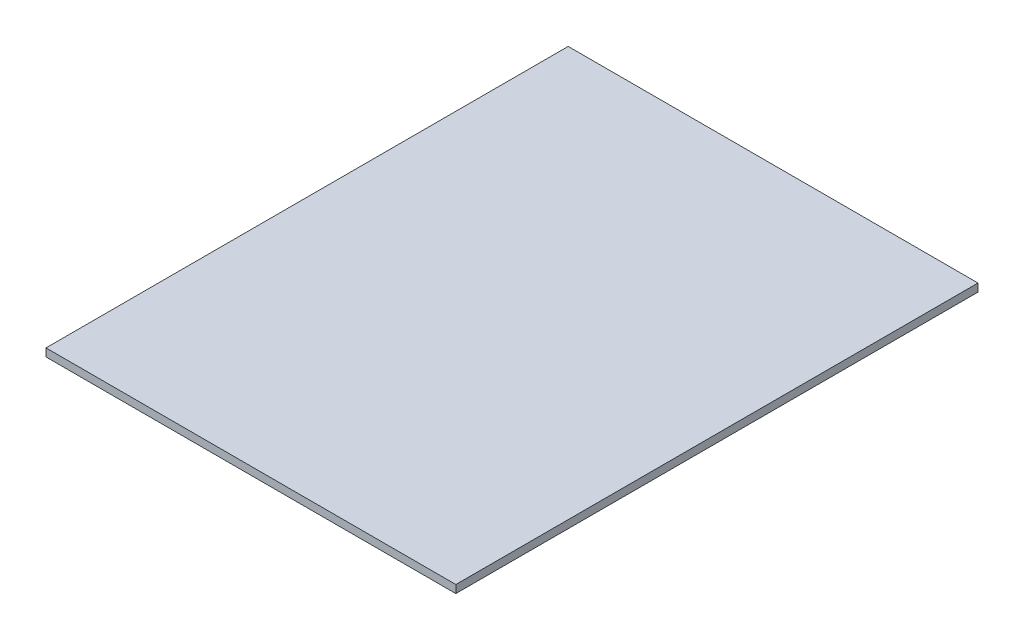
ISO-10303-21;
HEADER;
FILE_DESCRIPTION(('STEP AP214'),'2;1');
FILE_NAME('part.step','',(''),(''),'','','');
FILE_SCHEMA(('AUTOMOTIVE_DESIGN { 1 0 10303 214 1 1 1 1 }'));
ENDSEC;
DATA;
#1=APPLICATION_CONTEXT('core data for automotive mechanical design processes');
#2=APPLICATION_PROTOCOL_DEFINITION('international standard','automotive_design',2000,#1);
#3=PRODUCT_CONTEXT('',#1,'mechanical');
#4=PRODUCT('Part','Part','',(#3));
#5=PRODUCT_RELATED_PRODUCT_CATEGORY('part','',(#4));
#6=PRODUCT_DEFINITION_FORMATION('','',#4);
#7=PRODUCT_DEFINITION_CONTEXT('part definition',#1,'design');
#8=PRODUCT_DEFINITION('design','',#6,#7);
#9=PRODUCT_DEFINITION_SHAPE('','',#8);
#10=(LENGTH_UNIT() NAMED_UNIT(*) SI_UNIT(.MILLI.,.METRE.));
#11=(NAMED_UNIT(*) PLANE_ANGLE_UNIT() SI_UNIT($,.RADIAN.));
#12=(NAMED_UNIT(*) SI_UNIT($,.STERADIAN.) SOLID_ANGLE_UNIT());
#13=UNCERTAINTY_MEASURE_WITH_UNIT(LENGTH_MEASURE(1.E-05),#10,'distance_accuracy_value','');
#14=(GEOMETRIC_REPRESENTATION_CONTEXT(3) GLOBAL_UNCERTAINTY_ASSIGNED_CONTEXT((#13)) GLOBAL_UNIT_ASSIGNED_CONTEXT((#10,
#11,#12)) REPRESENTATION_CONTEXT('',''));
#15=CARTESIAN_POINT('',(0.,0.,0.));
#16=DIRECTION('',(0.,0.,1.));
#17=DIRECTION('',(1.,0.,0.));
#18=AXIS2_PLACEMENT_3D('',#15,#16,#17);
#19=CARTESIAN_POINT('',(-52.05,-4.09999999999999,66.32));
#20=DIRECTION('',(1.,0.,0.));
#21=DIRECTION('',(0.,0.,-1.));
#22=AXIS2_PLACEMENT_3D('',#19,#20,#21);
#23=PLANE('',#22);
#24=DIRECTION('',(0.,0.,-1.));
#25=VECTOR('',#24,1.);
#26=CARTESIAN_POINT('',(-52.05,-2.09999999999999,66.32));
#27=LINE('',#26,#25);
#28=CARTESIAN_POINT('',(-52.05,-2.09999999999999,66.32));
#29=VERTEX_POINT('',#28);
#30=CARTESIAN_POINT('',(-52.05,-2.10000000000002,-66.32));
#31=VERTEX_POINT('',#30);
#32=EDGE_CURVE('E95',#29,#31,#27,.T.);
#33=ORIENTED_EDGE('',*,*,#32,.T.);
#34=DIRECTION('',(0.,1.,0.));
#35=VECTOR('',#34,1.);
#36=CARTESIAN_POINT('',(-52.05,-4.10000000000001,-66.32));
#37=LINE('',#36,#35);
#38=CARTESIAN_POINT('',(-52.05,-4.10000000000001,-66.32));
#39=VERTEX_POINT('',#38);
#40=EDGE_CURVE('E11',#39,#31,#37,.T.);
#41=ORIENTED_EDGE('',*,*,#40,.F.);
#42=DIRECTION('',(0.,0.,-1.));
#43=VECTOR('',#42,1.);
#44=CARTESIAN_POINT('',(-52.05,-4.09999999999999,66.32));
#45=LINE('',#44,#43);
#46=CARTESIAN_POINT('',(-52.05,-4.09999999999999,66.32));
#47=VERTEX_POINT('',#46);
#48=EDGE_CURVE('E83',#47,#39,#45,.T.);
#49=ORIENTED_EDGE('',*,*,#48,.F.);
#50=DIRECTION('',(0.,1.,0.));
#51=VECTOR('',#50,1.);
#52=CARTESIAN_POINT('',(-52.05,-4.09999999999999,66.32));
#53=LINE('',#52,#51);
#54=EDGE_CURVE('E91',#47,#29,#53,.T.);
#55=ORIENTED_EDGE('',*,*,#54,.T.);
#56=EDGE_LOOP('',(#33,#41,#49,#55));
#57=FACE_BOUND('',#56,.T.);
#58=ADVANCED_FACE('F32',(#57),#23,.F.);
#59=CARTESIAN_POINT('',(-52.05,-4.10000000000001,-66.32));
#60=DIRECTION('',(0.,0.,1.));
#61=DIRECTION('',(0.,-1.,0.));
#62=AXIS2_PLACEMENT_3D('',#59,#60,#61);
#63=PLANE('',#62);
#64=DIRECTION('',(1.,0.,0.));
#65=VECTOR('',#64,1.);
#66=CARTESIAN_POINT('',(-52.05,-2.10000000000002,-66.32));
#67=LINE('',#66,#65);
#68=CARTESIAN_POINT('',(52.05,-2.10000000000002,-66.32));
#69=VERTEX_POINT('',#68);
#70=EDGE_CURVE('E87',#31,#69,#67,.T.);
#71=ORIENTED_EDGE('',*,*,#70,.T.);
#72=DIRECTION('',(0.,1.,0.));
#73=VECTOR('',#72,1.);
#74=CARTESIAN_POINT('',(52.05,-4.10000000000001,-66.32));
#75=LINE('',#74,#73);
#76=CARTESIAN_POINT('',(52.05,-4.10000000000001,-66.32));
#77=VERTEX_POINT('',#76);
#78=EDGE_CURVE('E40',#77,#69,#75,.T.);
#79=ORIENTED_EDGE('',*,*,#78,.F.);
#80=DIRECTION('',(1.,0.,0.));
#81=VECTOR('',#80,1.);
#82=CARTESIAN_POINT('',(-52.05,-4.10000000000001,-66.32));
#83=LINE('',#82,#81);
#84=EDGE_CURVE('E78',#39,#77,#83,.T.);
#85=ORIENTED_EDGE('',*,*,#84,.F.);
#86=ORIENTED_EDGE('',*,*,#40,.T.);
#87=EDGE_LOOP('',(#71,#79,#85,#86));
#88=FACE_BOUND('',#87,.T.);
#89=ADVANCED_FACE('F86',(#88),#63,.F.);
#90=CARTESIAN_POINT('',(52.05,-4.09999999999999,66.32));
#91=DIRECTION('',(-1.,0.,0.));
#92=DIRECTION('',(0.,0.,1.));
#93=AXIS2_PLACEMENT_3D('',#90,#91,#92);
#94=PLANE('',#93);
#95=DIRECTION('',(0.,0.,1.));
#96=VECTOR('',#95,1.);
#97=CARTESIAN_POINT('',(52.05,-2.09999999999999,66.32));
#98=LINE('',#97,#96);
#99=CARTESIAN_POINT('',(52.05,-2.09999999999999,66.32));
#100=VERTEX_POINT('',#99);
#101=EDGE_CURVE('E65',#69,#100,#98,.T.);
#102=ORIENTED_EDGE('',*,*,#101,.T.);
#103=DIRECTION('',(0.,1.,0.));
#104=VECTOR('',#103,1.);
#105=CARTESIAN_POINT('',(52.05,-4.09999999999999,66.32));
#106=LINE('',#105,#104);
#107=CARTESIAN_POINT('',(52.05,-4.09999999999999,66.32));
#108=VERTEX_POINT('',#107);
#109=EDGE_CURVE('E88',#108,#100,#106,.T.);
#110=ORIENTED_EDGE('',*,*,#109,.F.);
#111=DIRECTION('',(0.,0.,1.));
#112=VECTOR('',#111,1.);
#113=CARTESIAN_POINT('',(52.05,-4.09999999999999,66.32));
#114=LINE('',#113,#112);
#115=EDGE_CURVE('E81',#77,#108,#114,.T.);
#116=ORIENTED_EDGE('',*,*,#115,.F.);
#117=ORIENTED_EDGE('',*,*,#78,.T.);
#118=EDGE_LOOP('',(#102,#110,#116,#117));
#119=FACE_BOUND('',#118,.T.);
#120=ADVANCED_FACE('F89',(#119),#94,.F.);
#121=CARTESIAN_POINT('',(-52.05,-4.09999999999999,66.32));
#122=DIRECTION('',(0.,0.,-1.));
#123=DIRECTION('',(0.,1.,0.));
#124=AXIS2_PLACEMENT_3D('',#121,#122,#123);
#125=PLANE('',#124);
#126=DIRECTION('',(-1.,0.,0.));
#127=VECTOR('',#126,1.);
#128=CARTESIAN_POINT('',(-52.05,-2.09999999999999,66.32));
#129=LINE('',#128,#127);
#130=EDGE_CURVE('E71',#100,#29,#129,.T.);
#131=ORIENTED_EDGE('',*,*,#130,.T.);
#132=ORIENTED_EDGE('',*,*,#54,.F.);
#133=DIRECTION('',(-1.,0.,0.));
#134=VECTOR('',#133,1.);
#135=CARTESIAN_POINT('',(-52.05,-4.09999999999999,66.32));
#136=LINE('',#135,#134);
#137=EDGE_CURVE('E48',#108,#47,#136,.T.);
#138=ORIENTED_EDGE('',*,*,#137,.F.);
#139=ORIENTED_EDGE('',*,*,#109,.T.);
#140=EDGE_LOOP('',(#131,#132,#138,#139));
#141=FACE_BOUND('',#140,.T.);
#142=ADVANCED_FACE('F102',(#141),#125,.F.);
#143=CARTESIAN_POINT('',(0.,-4.1,0.));
#144=DIRECTION('',(0.,-1.,0.));
#145=DIRECTION('',(0.,0.,-1.));
#146=AXIS2_PLACEMENT_3D('',#143,#144,#145);
#147=PLANE('',#146);
#148=ORIENTED_EDGE('',*,*,#48,.T.);
#149=ORIENTED_EDGE('',*,*,#84,.T.);
#150=ORIENTED_EDGE('',*,*,#115,.T.);
#151=ORIENTED_EDGE('',*,*,#137,.T.);
#152=EDGE_LOOP('',(#148,#149,#150,#151));
#153=FACE_BOUND('',#152,.T.);
#154=ADVANCED_FACE('F79',(#153),#147,.T.);
#155=CARTESIAN_POINT('',(0.,-2.1,0.));
#156=DIRECTION('',(0.,-1.,0.));
#157=DIRECTION('',(0.,0.,-1.));
#158=AXIS2_PLACEMENT_3D('',#155,#156,#157);
#159=PLANE('',#158);
#160=ORIENTED_EDGE('',*,*,#32,.F.);
#161=ORIENTED_EDGE('',*,*,#130,.F.);
#162=ORIENTED_EDGE('',*,*,#101,.F.);
#163=ORIENTED_EDGE('',*,*,#70,.F.);
#164=EDGE_LOOP('',(#160,#161,#162,#163));
#165=FACE_BOUND('',#164,.T.);
#166=ADVANCED_FACE('F105',(#165),#159,.F.);
#167=CLOSED_SHELL('',(#58,#89,#120,#142,#154,#166));
#168=MANIFOLD_SOLID_BREP('B2',#167);
#169=ADVANCED_BREP_SHAPE_REPRESENTATION('',(#18,#168),#14);
#170=SHAPE_DEFINITION_REPRESENTATION(#9,#169);
ENDSEC;
END-ISO-10303-21;
